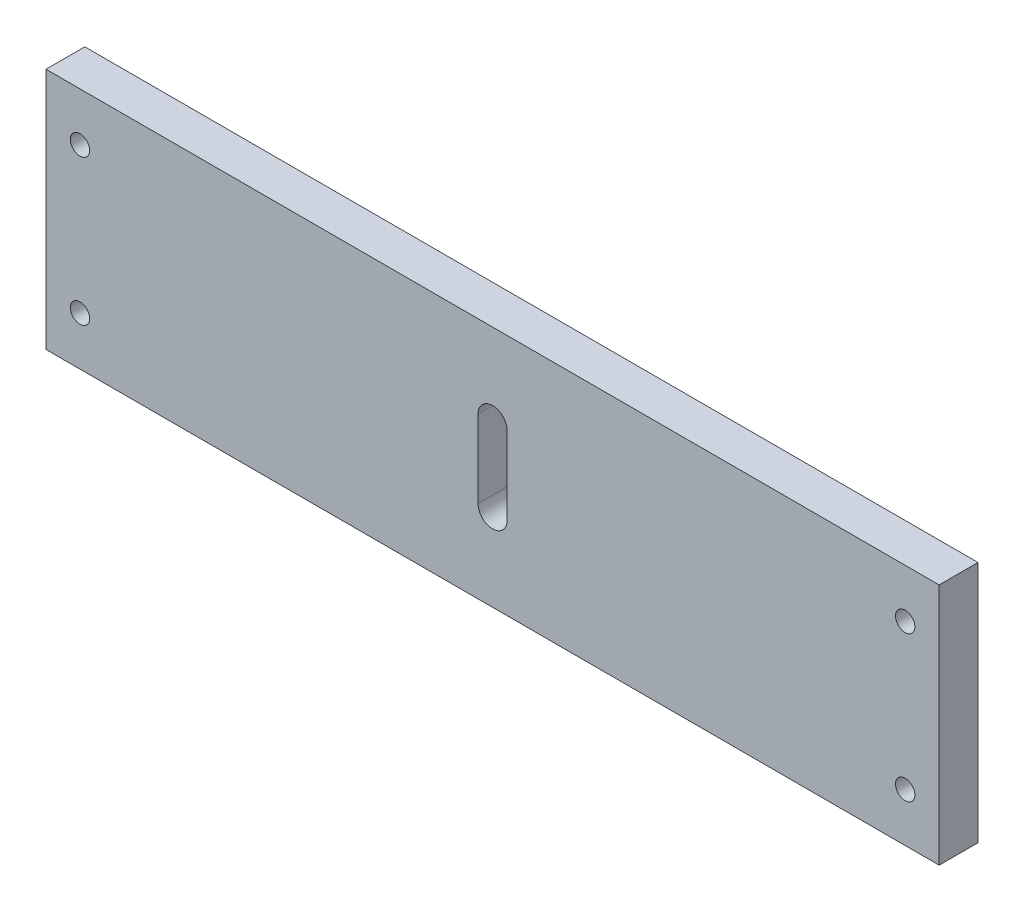
ISO-10303-21;
HEADER;
FILE_DESCRIPTION(('STEP AP214'),'2;1');
FILE_NAME('part.step','',(''),(''),'','','');
FILE_SCHEMA(('AUTOMOTIVE_DESIGN { 1 0 10303 214 1 1 1 1 }'));
ENDSEC;
DATA;
#1=APPLICATION_CONTEXT('core data for automotive mechanical design processes');
#2=APPLICATION_PROTOCOL_DEFINITION('international standard','automotive_design',2000,#1);
#3=PRODUCT_CONTEXT('',#1,'mechanical');
#4=PRODUCT('Part','Part','',(#3));
#5=PRODUCT_RELATED_PRODUCT_CATEGORY('part','',(#4));
#6=PRODUCT_DEFINITION_FORMATION('','',#4);
#7=PRODUCT_DEFINITION_CONTEXT('part definition',#1,'design');
#8=PRODUCT_DEFINITION('design','',#6,#7);
#9=PRODUCT_DEFINITION_SHAPE('','',#8);
#10=(LENGTH_UNIT() NAMED_UNIT(*) SI_UNIT(.MILLI.,.METRE.));
#11=(NAMED_UNIT(*) PLANE_ANGLE_UNIT() SI_UNIT($,.RADIAN.));
#12=(NAMED_UNIT(*) SI_UNIT($,.STERADIAN.) SOLID_ANGLE_UNIT());
#13=UNCERTAINTY_MEASURE_WITH_UNIT(LENGTH_MEASURE(1.E-05),#10,'distance_accuracy_value','');
#14=(GEOMETRIC_REPRESENTATION_CONTEXT(3) GLOBAL_UNCERTAINTY_ASSIGNED_CONTEXT((#13)) GLOBAL_UNIT_ASSIGNED_CONTEXT((#10,
#11,#12)) REPRESENTATION_CONTEXT('',''));
#15=CARTESIAN_POINT('',(0.,0.,0.));
#16=DIRECTION('',(0.,0.,1.));
#17=DIRECTION('',(1.,0.,0.));
#18=AXIS2_PLACEMENT_3D('',#15,#16,#17);
#19=CARTESIAN_POINT('',(0.,0.,4.));
#20=DIRECTION('',(0.,0.,-1.));
#21=DIRECTION('',(-1.,0.,0.));
#22=AXIS2_PLACEMENT_3D('',#19,#20,#21);
#23=PLANE('',#22);
#24=CARTESIAN_POINT('',(3220.33744334995,1625.59430721516,4.));
#25=DIRECTION('',(0.,0.,1.));
#26=DIRECTION('',(1.,0.,0.));
#27=AXIS2_PLACEMENT_3D('',#24,#25,#26);
#28=CIRCLE('',#27,0.99999999999989);
#29=CARTESIAN_POINT('',(3221.33744334995,1625.59430721516,4.));
#30=VERTEX_POINT('',#29);
#31=EDGE_CURVE('E138',#30,#30,#28,.T.);
#32=ORIENTED_EDGE('',*,*,#31,.F.);
#33=EDGE_LOOP('',(#32));
#34=FACE_BOUND('',#33,.T.);
#35=CARTESIAN_POINT('',(3220.33744334995,1610.59430721516,4.));
#36=DIRECTION('',(0.,0.,1.));
#37=DIRECTION('',(1.,0.,0.));
#38=AXIS2_PLACEMENT_3D('',#35,#36,#37);
#39=CIRCLE('',#38,0.99999999999989);
#40=CARTESIAN_POINT('',(3221.33744334995,1610.59430721516,4.));
#41=VERTEX_POINT('',#40);
#42=EDGE_CURVE('E144',#41,#41,#39,.T.);
#43=ORIENTED_EDGE('',*,*,#42,.F.);
#44=EDGE_LOOP('',(#43));
#45=FACE_BOUND('',#44,.T.);
#46=CARTESIAN_POINT('',(3135.33744334995,1610.59430721516,4.));
#47=DIRECTION('',(0.,0.,1.));
#48=DIRECTION('',(1.,0.,0.));
#49=AXIS2_PLACEMENT_3D('',#46,#47,#48);
#50=CIRCLE('',#49,0.99999999999989);
#51=CARTESIAN_POINT('',(3136.33744334995,1610.59430721516,4.));
#52=VERTEX_POINT('',#51);
#53=EDGE_CURVE('E150',#52,#52,#50,.T.);
#54=ORIENTED_EDGE('',*,*,#53,.F.);
#55=EDGE_LOOP('',(#54));
#56=FACE_BOUND('',#55,.T.);
#57=CARTESIAN_POINT('',(3135.33744334995,1625.59430721516,4.));
#58=DIRECTION('',(0.,0.,1.));
#59=DIRECTION('',(1.,0.,0.));
#60=AXIS2_PLACEMENT_3D('',#57,#58,#59);
#61=CIRCLE('',#60,0.99999999999989);
#62=CARTESIAN_POINT('',(3136.33744334995,1625.59430721516,4.));
#63=VERTEX_POINT('',#62);
#64=EDGE_CURVE('E156',#63,#63,#61,.T.);
#65=ORIENTED_EDGE('',*,*,#64,.F.);
#66=EDGE_LOOP('',(#65));
#67=FACE_BOUND('',#66,.T.);
#68=DIRECTION('',(1.,0.,0.));
#69=VECTOR('',#68,1.);
#70=CARTESIAN_POINT('',(3131.83744334995,1605.59430721516,4.));
#71=LINE('',#70,#69);
#72=CARTESIAN_POINT('',(3131.83744334995,1605.59430721516,4.));
#73=VERTEX_POINT('',#72);
#74=CARTESIAN_POINT('',(3223.83744334995,1605.59430721516,4.));
#75=VERTEX_POINT('',#74);
#76=EDGE_CURVE('E162',#73,#75,#71,.T.);
#77=ORIENTED_EDGE('',*,*,#76,.T.);
#78=DIRECTION('',(0.,1.,0.));
#79=VECTOR('',#78,1.);
#80=CARTESIAN_POINT('',(3223.83744334995,1630.59430721516,4.));
#81=LINE('',#80,#79);
#82=CARTESIAN_POINT('',(3223.83744334995,1630.59430721516,4.));
#83=VERTEX_POINT('',#82);
#84=EDGE_CURVE('E165',#75,#83,#81,.T.);
#85=ORIENTED_EDGE('',*,*,#84,.T.);
#86=DIRECTION('',(-1.,0.,0.));
#87=VECTOR('',#86,1.);
#88=CARTESIAN_POINT('',(3131.83744334995,1630.59430721516,4.));
#89=LINE('',#88,#87);
#90=CARTESIAN_POINT('',(3131.83744334995,1630.59430721516,4.));
#91=VERTEX_POINT('',#90);
#92=EDGE_CURVE('E168',#83,#91,#89,.T.);
#93=ORIENTED_EDGE('',*,*,#92,.T.);
#94=DIRECTION('',(0.,-1.,0.));
#95=VECTOR('',#94,1.);
#96=CARTESIAN_POINT('',(3131.83744334995,1605.59430721516,4.));
#97=LINE('',#96,#95);
#98=EDGE_CURVE('E170',#91,#73,#97,.T.);
#99=ORIENTED_EDGE('',*,*,#98,.T.);
#100=EDGE_LOOP('',(#77,#85,#93,#99));
#101=FACE_BOUND('',#100,.T.);
#102=CARTESIAN_POINT('',(3177.83744334995,1622.09430721516,4.));
#103=DIRECTION('',(0.,0.,1.));
#104=DIRECTION('',(1.,0.,0.));
#105=AXIS2_PLACEMENT_3D('',#102,#103,#104);
#106=CIRCLE('',#105,1.50000000000006);
#107=CARTESIAN_POINT('',(3179.33744334995,1622.09430721516,4.));
#108=VERTEX_POINT('',#107);
#109=CARTESIAN_POINT('',(3176.33744334995,1622.09430721516,4.));
#110=VERTEX_POINT('',#109);
#111=EDGE_CURVE('E102',#108,#110,#106,.T.);
#112=ORIENTED_EDGE('',*,*,#111,.F.);
#113=DIRECTION('',(0.,1.,0.));
#114=VECTOR('',#113,1.);
#115=CARTESIAN_POINT('',(3179.33744334995,1622.09430721516,4.));
#116=LINE('',#115,#114);
#117=CARTESIAN_POINT('',(3179.33744334995,1614.09430721516,4.));
#118=VERTEX_POINT('',#117);
#119=EDGE_CURVE('E124',#118,#108,#116,.T.);
#120=ORIENTED_EDGE('',*,*,#119,.F.);
#121=CARTESIAN_POINT('',(3177.83744334995,1614.09430721516,4.));
#122=DIRECTION('',(0.,0.,1.));
#123=DIRECTION('',(1.,0.,0.));
#124=AXIS2_PLACEMENT_3D('',#121,#122,#123);
#125=CIRCLE('',#124,1.50000000000006);
#126=CARTESIAN_POINT('',(3176.33744334995,1614.09430721516,4.));
#127=VERTEX_POINT('',#126);
#128=EDGE_CURVE('E122',#127,#118,#125,.T.);
#129=ORIENTED_EDGE('',*,*,#128,.F.);
#130=DIRECTION('',(0.,-1.,0.));
#131=VECTOR('',#130,1.);
#132=CARTESIAN_POINT('',(3176.33744334995,1614.09430721516,4.));
#133=LINE('',#132,#131);
#134=EDGE_CURVE('E110',#110,#127,#133,.T.);
#135=ORIENTED_EDGE('',*,*,#134,.F.);
#136=EDGE_LOOP('',(#112,#120,#129,#135));
#137=FACE_BOUND('',#136,.T.);
#138=ADVANCED_FACE('F37',(#34,#45,#56,#67,#101,#137),#23,.F.);
#139=CARTESIAN_POINT('',(0.,0.,0.));
#140=DIRECTION('',(0.,0.,-1.));
#141=DIRECTION('',(-1.,0.,0.));
#142=AXIS2_PLACEMENT_3D('',#139,#140,#141);
#143=PLANE('',#142);
#144=CARTESIAN_POINT('',(3220.33744334995,1610.59430721516,0.));
#145=DIRECTION('',(0.,0.,1.));
#146=DIRECTION('',(1.,0.,0.));
#147=AXIS2_PLACEMENT_3D('',#144,#145,#146);
#148=CIRCLE('',#147,0.99999999999989);
#149=CARTESIAN_POINT('',(3221.33744334995,1610.59430721516,0.));
#150=VERTEX_POINT('',#149);
#151=EDGE_CURVE('E141',#150,#150,#148,.T.);
#152=ORIENTED_EDGE('',*,*,#151,.T.);
#153=EDGE_LOOP('',(#152));
#154=FACE_BOUND('',#153,.T.);
#155=CARTESIAN_POINT('',(3135.33744334995,1625.59430721516,0.));
#156=DIRECTION('',(0.,0.,1.));
#157=DIRECTION('',(1.,0.,0.));
#158=AXIS2_PLACEMENT_3D('',#155,#156,#157);
#159=CIRCLE('',#158,0.99999999999989);
#160=CARTESIAN_POINT('',(3136.33744334995,1625.59430721516,0.));
#161=VERTEX_POINT('',#160);
#162=EDGE_CURVE('E153',#161,#161,#159,.T.);
#163=ORIENTED_EDGE('',*,*,#162,.T.);
#164=EDGE_LOOP('',(#163));
#165=FACE_BOUND('',#164,.T.);
#166=DIRECTION('',(1.,0.,0.));
#167=VECTOR('',#166,1.);
#168=CARTESIAN_POINT('',(3131.83744334995,1605.59430721516,0.));
#169=LINE('',#168,#167);
#170=CARTESIAN_POINT('',(3131.83744334995,1605.59430721516,0.));
#171=VERTEX_POINT('',#170);
#172=CARTESIAN_POINT('',(3223.83744334995,1605.59430721516,0.));
#173=VERTEX_POINT('',#172);
#174=EDGE_CURVE('E159',#171,#173,#169,.T.);
#175=ORIENTED_EDGE('',*,*,#174,.F.);
#176=DIRECTION('',(0.,-1.,0.));
#177=VECTOR('',#176,1.);
#178=CARTESIAN_POINT('',(3131.83744334995,1605.59430721516,0.));
#179=LINE('',#178,#177);
#180=CARTESIAN_POINT('',(3131.83744334995,1630.59430721516,0.));
#181=VERTEX_POINT('',#180);
#182=EDGE_CURVE('E166',#181,#171,#179,.T.);
#183=ORIENTED_EDGE('',*,*,#182,.F.);
#184=DIRECTION('',(-1.,0.,0.));
#185=VECTOR('',#184,1.);
#186=CARTESIAN_POINT('',(3131.83744334995,1630.59430721516,0.));
#187=LINE('',#186,#185);
#188=CARTESIAN_POINT('',(3223.83744334995,1630.59430721516,0.));
#189=VERTEX_POINT('',#188);
#190=EDGE_CURVE('E177',#189,#181,#187,.T.);
#191=ORIENTED_EDGE('',*,*,#190,.F.);
#192=DIRECTION('',(0.,1.,0.));
#193=VECTOR('',#192,1.);
#194=CARTESIAN_POINT('',(3223.83744334995,1630.59430721516,0.));
#195=LINE('',#194,#193);
#196=EDGE_CURVE('E175',#173,#189,#195,.T.);
#197=ORIENTED_EDGE('',*,*,#196,.F.);
#198=EDGE_LOOP('',(#175,#183,#191,#197));
#199=FACE_BOUND('',#198,.T.);
#200=CARTESIAN_POINT('',(3135.33744334995,1610.59430721516,0.));
#201=DIRECTION('',(0.,0.,1.));
#202=DIRECTION('',(1.,0.,0.));
#203=AXIS2_PLACEMENT_3D('',#200,#201,#202);
#204=CIRCLE('',#203,0.99999999999989);
#205=CARTESIAN_POINT('',(3136.33744334995,1610.59430721516,0.));
#206=VERTEX_POINT('',#205);
#207=EDGE_CURVE('E147',#206,#206,#204,.T.);
#208=ORIENTED_EDGE('',*,*,#207,.T.);
#209=EDGE_LOOP('',(#208));
#210=FACE_BOUND('',#209,.T.);
#211=CARTESIAN_POINT('',(3220.33744334995,1625.59430721516,0.));
#212=DIRECTION('',(0.,0.,1.));
#213=DIRECTION('',(1.,0.,0.));
#214=AXIS2_PLACEMENT_3D('',#211,#212,#213);
#215=CIRCLE('',#214,0.99999999999989);
#216=CARTESIAN_POINT('',(3221.33744334995,1625.59430721516,0.));
#217=VERTEX_POINT('',#216);
#218=EDGE_CURVE('E118',#217,#217,#215,.T.);
#219=ORIENTED_EDGE('',*,*,#218,.T.);
#220=EDGE_LOOP('',(#219));
#221=FACE_BOUND('',#220,.T.);
#222=DIRECTION('',(0.,1.,0.));
#223=VECTOR('',#222,1.);
#224=CARTESIAN_POINT('',(3179.33744334995,1622.09430721516,0.));
#225=LINE('',#224,#223);
#226=CARTESIAN_POINT('',(3179.33744334995,1614.09430721516,0.));
#227=VERTEX_POINT('',#226);
#228=CARTESIAN_POINT('',(3179.33744334995,1622.09430721516,0.));
#229=VERTEX_POINT('',#228);
#230=EDGE_CURVE('E111',#227,#229,#225,.T.);
#231=ORIENTED_EDGE('',*,*,#230,.T.);
#232=CARTESIAN_POINT('',(3177.83744334995,1622.09430721516,0.));
#233=DIRECTION('',(0.,0.,1.));
#234=DIRECTION('',(1.,0.,0.));
#235=AXIS2_PLACEMENT_3D('',#232,#233,#234);
#236=CIRCLE('',#235,1.50000000000006);
#237=CARTESIAN_POINT('',(3176.33744334995,1622.09430721516,0.));
#238=VERTEX_POINT('',#237);
#239=EDGE_CURVE('E60',#229,#238,#236,.T.);
#240=ORIENTED_EDGE('',*,*,#239,.T.);
#241=DIRECTION('',(0.,-1.,0.));
#242=VECTOR('',#241,1.);
#243=CARTESIAN_POINT('',(3176.33744334995,1614.09430721516,0.));
#244=LINE('',#243,#242);
#245=CARTESIAN_POINT('',(3176.33744334995,1614.09430721516,0.));
#246=VERTEX_POINT('',#245);
#247=EDGE_CURVE('E117',#238,#246,#244,.T.);
#248=ORIENTED_EDGE('',*,*,#247,.T.);
#249=CARTESIAN_POINT('',(3177.83744334995,1614.09430721516,0.));
#250=DIRECTION('',(0.,0.,1.));
#251=DIRECTION('',(1.,0.,0.));
#252=AXIS2_PLACEMENT_3D('',#249,#250,#251);
#253=CIRCLE('',#252,1.50000000000006);
#254=EDGE_CURVE('E130',#246,#227,#253,.T.);
#255=ORIENTED_EDGE('',*,*,#254,.T.);
#256=EDGE_LOOP('',(#231,#240,#248,#255));
#257=FACE_BOUND('',#256,.T.);
#258=ADVANCED_FACE('F195',(#154,#165,#199,#210,#221,#257),#143,.T.);
#259=CARTESIAN_POINT('',(3131.83744334995,1605.59430721516,4.));
#260=DIRECTION('',(0.,1.,0.));
#261=DIRECTION('',(0.,0.,1.));
#262=AXIS2_PLACEMENT_3D('',#259,#260,#261);
#263=PLANE('',#262);
#264=ORIENTED_EDGE('',*,*,#174,.T.);
#265=DIRECTION('',(0.,0.,-1.));
#266=VECTOR('',#265,1.);
#267=CARTESIAN_POINT('',(3223.83744334995,1605.59430721516,4.));
#268=LINE('',#267,#266);
#269=EDGE_CURVE('E11',#75,#173,#268,.T.);
#270=ORIENTED_EDGE('',*,*,#269,.F.);
#271=ORIENTED_EDGE('',*,*,#76,.F.);
#272=DIRECTION('',(0.,0.,-1.));
#273=VECTOR('',#272,1.);
#274=CARTESIAN_POINT('',(3131.83744334995,1605.59430721516,4.));
#275=LINE('',#274,#273);
#276=EDGE_CURVE('E172',#73,#171,#275,.T.);
#277=ORIENTED_EDGE('',*,*,#276,.T.);
#278=EDGE_LOOP('',(#264,#270,#271,#277));
#279=FACE_BOUND('',#278,.T.);
#280=ADVANCED_FACE('F39',(#279),#263,.F.);
#281=CARTESIAN_POINT('',(3223.83744334995,1630.59430721516,4.));
#282=DIRECTION('',(-1.,0.,0.));
#283=DIRECTION('',(0.,0.,1.));
#284=AXIS2_PLACEMENT_3D('',#281,#282,#283);
#285=PLANE('',#284);
#286=ORIENTED_EDGE('',*,*,#196,.T.);
#287=DIRECTION('',(0.,0.,-1.));
#288=VECTOR('',#287,1.);
#289=CARTESIAN_POINT('',(3223.83744334995,1630.59430721516,4.));
#290=LINE('',#289,#288);
#291=EDGE_CURVE('E45',#83,#189,#290,.T.);
#292=ORIENTED_EDGE('',*,*,#291,.F.);
#293=ORIENTED_EDGE('',*,*,#84,.F.);
#294=ORIENTED_EDGE('',*,*,#269,.T.);
#295=EDGE_LOOP('',(#286,#292,#293,#294));
#296=FACE_BOUND('',#295,.T.);
#297=ADVANCED_FACE('F205',(#296),#285,.F.);
#298=CARTESIAN_POINT('',(3131.83744334995,1630.59430721516,4.));
#299=DIRECTION('',(0.,-1.,0.));
#300=DIRECTION('',(0.,0.,-1.));
#301=AXIS2_PLACEMENT_3D('',#298,#299,#300);
#302=PLANE('',#301);
#303=ORIENTED_EDGE('',*,*,#190,.T.);
#304=DIRECTION('',(0.,0.,-1.));
#305=VECTOR('',#304,1.);
#306=CARTESIAN_POINT('',(3131.83744334995,1630.59430721516,4.));
#307=LINE('',#306,#305);
#308=EDGE_CURVE('E182',#91,#181,#307,.T.);
#309=ORIENTED_EDGE('',*,*,#308,.F.);
#310=ORIENTED_EDGE('',*,*,#92,.F.);
#311=ORIENTED_EDGE('',*,*,#291,.T.);
#312=EDGE_LOOP('',(#303,#309,#310,#311));
#313=FACE_BOUND('',#312,.T.);
#314=ADVANCED_FACE('F189',(#313),#302,.F.);
#315=CARTESIAN_POINT('',(3131.83744334995,1605.59430721516,4.));
#316=DIRECTION('',(1.,0.,0.));
#317=DIRECTION('',(0.,0.,-1.));
#318=AXIS2_PLACEMENT_3D('',#315,#316,#317);
#319=PLANE('',#318);
#320=ORIENTED_EDGE('',*,*,#182,.T.);
#321=ORIENTED_EDGE('',*,*,#276,.F.);
#322=ORIENTED_EDGE('',*,*,#98,.F.);
#323=ORIENTED_EDGE('',*,*,#308,.T.);
#324=EDGE_LOOP('',(#320,#321,#322,#323));
#325=FACE_BOUND('',#324,.T.);
#326=ADVANCED_FACE('F199',(#325),#319,.F.);
#327=CARTESIAN_POINT('',(3135.33744334995,1625.59430721516,4.));
#328=DIRECTION('',(0.,0.,-1.));
#329=DIRECTION('',(-1.,0.,0.));
#330=AXIS2_PLACEMENT_3D('',#327,#328,#329);
#331=CYLINDRICAL_SURFACE('',#330,0.99999999999989);
#332=ORIENTED_EDGE('',*,*,#64,.T.);
#333=EDGE_LOOP('',(#332));
#334=FACE_BOUND('',#333,.T.);
#335=ORIENTED_EDGE('',*,*,#162,.F.);
#336=EDGE_LOOP('',(#335));
#337=FACE_BOUND('',#336,.T.);
#338=ADVANCED_FACE('F223',(#334,#337),#331,.F.);
#339=CARTESIAN_POINT('',(3135.33744334995,1610.59430721516,4.));
#340=DIRECTION('',(0.,0.,-1.));
#341=DIRECTION('',(-1.,0.,0.));
#342=AXIS2_PLACEMENT_3D('',#339,#340,#341);
#343=CYLINDRICAL_SURFACE('',#342,0.99999999999989);
#344=ORIENTED_EDGE('',*,*,#53,.T.);
#345=EDGE_LOOP('',(#344));
#346=FACE_BOUND('',#345,.T.);
#347=ORIENTED_EDGE('',*,*,#207,.F.);
#348=EDGE_LOOP('',(#347));
#349=FACE_BOUND('',#348,.T.);
#350=ADVANCED_FACE('F230',(#346,#349),#343,.F.);
#351=CARTESIAN_POINT('',(3220.33744334995,1610.59430721516,4.));
#352=DIRECTION('',(0.,0.,-1.));
#353=DIRECTION('',(-1.,0.,0.));
#354=AXIS2_PLACEMENT_3D('',#351,#352,#353);
#355=CYLINDRICAL_SURFACE('',#354,0.99999999999989);
#356=ORIENTED_EDGE('',*,*,#42,.T.);
#357=EDGE_LOOP('',(#356));
#358=FACE_BOUND('',#357,.T.);
#359=ORIENTED_EDGE('',*,*,#151,.F.);
#360=EDGE_LOOP('',(#359));
#361=FACE_BOUND('',#360,.T.);
#362=ADVANCED_FACE('F235',(#358,#361),#355,.F.);
#363=CARTESIAN_POINT('',(3220.33744334995,1625.59430721516,4.));
#364=DIRECTION('',(0.,0.,-1.));
#365=DIRECTION('',(-1.,0.,0.));
#366=AXIS2_PLACEMENT_3D('',#363,#364,#365);
#367=CYLINDRICAL_SURFACE('',#366,0.99999999999989);
#368=ORIENTED_EDGE('',*,*,#31,.T.);
#369=EDGE_LOOP('',(#368));
#370=FACE_BOUND('',#369,.T.);
#371=ORIENTED_EDGE('',*,*,#218,.F.);
#372=EDGE_LOOP('',(#371));
#373=FACE_BOUND('',#372,.T.);
#374=ADVANCED_FACE('F245',(#370,#373),#367,.F.);
#375=CARTESIAN_POINT('',(3177.83744334995,1622.09430721516,4.));
#376=DIRECTION('',(0.,0.,-1.));
#377=DIRECTION('',(-1.,0.,0.));
#378=AXIS2_PLACEMENT_3D('',#375,#376,#377);
#379=CYLINDRICAL_SURFACE('',#378,1.50000000000006);
#380=ORIENTED_EDGE('',*,*,#239,.F.);
#381=DIRECTION('',(0.,0.,-1.));
#382=VECTOR('',#381,1.);
#383=CARTESIAN_POINT('',(3179.33744334995,1622.09430721516,4.));
#384=LINE('',#383,#382);
#385=EDGE_CURVE('E106',#108,#229,#384,.T.);
#386=ORIENTED_EDGE('',*,*,#385,.F.);
#387=ORIENTED_EDGE('',*,*,#111,.T.);
#388=DIRECTION('',(0.,0.,-1.));
#389=VECTOR('',#388,1.);
#390=CARTESIAN_POINT('',(3176.33744334995,1622.09430721516,4.));
#391=LINE('',#390,#389);
#392=EDGE_CURVE('E105',#110,#238,#391,.T.);
#393=ORIENTED_EDGE('',*,*,#392,.T.);
#394=EDGE_LOOP('',(#380,#386,#387,#393));
#395=FACE_BOUND('',#394,.T.);
#396=ADVANCED_FACE('F104',(#395),#379,.F.);
#397=CARTESIAN_POINT('',(3176.33744334995,1614.09430721516,4.));
#398=DIRECTION('',(1.,0.,0.));
#399=DIRECTION('',(0.,1.,0.));
#400=AXIS2_PLACEMENT_3D('',#397,#398,#399);
#401=PLANE('',#400);
#402=ORIENTED_EDGE('',*,*,#247,.F.);
#403=ORIENTED_EDGE('',*,*,#392,.F.);
#404=ORIENTED_EDGE('',*,*,#134,.T.);
#405=DIRECTION('',(0.,0.,-1.));
#406=VECTOR('',#405,1.);
#407=CARTESIAN_POINT('',(3176.33744334995,1614.09430721516,4.));
#408=LINE('',#407,#406);
#409=EDGE_CURVE('E119',#127,#246,#408,.T.);
#410=ORIENTED_EDGE('',*,*,#409,.T.);
#411=EDGE_LOOP('',(#402,#403,#404,#410));
#412=FACE_BOUND('',#411,.T.);
#413=ADVANCED_FACE('F114',(#412),#401,.T.);
#414=CARTESIAN_POINT('',(3177.83744334995,1614.09430721516,4.));
#415=DIRECTION('',(0.,0.,-1.));
#416=DIRECTION('',(-1.,0.,0.));
#417=AXIS2_PLACEMENT_3D('',#414,#415,#416);
#418=CYLINDRICAL_SURFACE('',#417,1.50000000000006);
#419=ORIENTED_EDGE('',*,*,#254,.F.);
#420=ORIENTED_EDGE('',*,*,#409,.F.);
#421=ORIENTED_EDGE('',*,*,#128,.T.);
#422=DIRECTION('',(0.,0.,-1.));
#423=VECTOR('',#422,1.);
#424=CARTESIAN_POINT('',(3179.33744334995,1614.09430721516,4.));
#425=LINE('',#424,#423);
#426=EDGE_CURVE('E52',#118,#227,#425,.T.);
#427=ORIENTED_EDGE('',*,*,#426,.T.);
#428=EDGE_LOOP('',(#419,#420,#421,#427));
#429=FACE_BOUND('',#428,.T.);
#430=ADVANCED_FACE('F257',(#429),#418,.F.);
#431=CARTESIAN_POINT('',(3179.33744334995,1622.09430721516,4.));
#432=DIRECTION('',(-1.,0.,0.));
#433=DIRECTION('',(0.,-1.,0.));
#434=AXIS2_PLACEMENT_3D('',#431,#432,#433);
#435=PLANE('',#434);
#436=ORIENTED_EDGE('',*,*,#230,.F.);
#437=ORIENTED_EDGE('',*,*,#426,.F.);
#438=ORIENTED_EDGE('',*,*,#119,.T.);
#439=ORIENTED_EDGE('',*,*,#385,.T.);
#440=EDGE_LOOP('',(#436,#437,#438,#439));
#441=FACE_BOUND('',#440,.T.);
#442=ADVANCED_FACE('F260',(#441),#435,.T.);
#443=CLOSED_SHELL('',(#138,#258,#280,#297,#314,#326,#338,#350,#362,#374,#396,#413,#430,#442));
#444=MANIFOLD_SOLID_BREP('B2',#443);
#445=ADVANCED_BREP_SHAPE_REPRESENTATION('',(#18,#444),#14);
#446=SHAPE_DEFINITION_REPRESENTATION(#9,#445);
ENDSEC;
END-ISO-10303-21;
